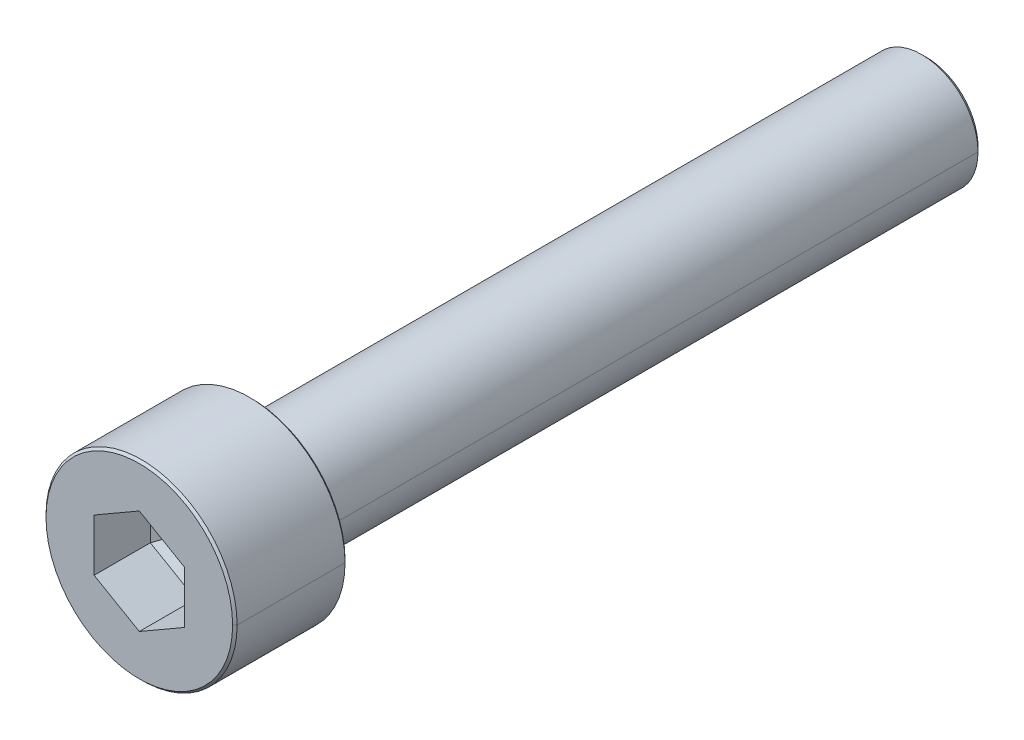
ISO-10303-21;
HEADER;
FILE_DESCRIPTION(('STEP AP214'),'2;1');
FILE_NAME('part.step','',(''),(''),'','','');
FILE_SCHEMA(('AUTOMOTIVE_DESIGN { 1 0 10303 214 1 1 1 1 }'));
ENDSEC;
DATA;
#1=APPLICATION_CONTEXT('core data for automotive mechanical design processes');
#2=APPLICATION_PROTOCOL_DEFINITION('international standard','automotive_design',2000,#1);
#3=PRODUCT_CONTEXT('',#1,'mechanical');
#4=PRODUCT('Part','Part','',(#3));
#5=PRODUCT_RELATED_PRODUCT_CATEGORY('part','',(#4));
#6=PRODUCT_DEFINITION_FORMATION('','',#4);
#7=PRODUCT_DEFINITION_CONTEXT('part definition',#1,'design');
#8=PRODUCT_DEFINITION('design','',#6,#7);
#9=PRODUCT_DEFINITION_SHAPE('','',#8);
#10=(LENGTH_UNIT() NAMED_UNIT(*) SI_UNIT(.MILLI.,.METRE.));
#11=(NAMED_UNIT(*) PLANE_ANGLE_UNIT() SI_UNIT($,.RADIAN.));
#12=(NAMED_UNIT(*) SI_UNIT($,.STERADIAN.) SOLID_ANGLE_UNIT());
#13=UNCERTAINTY_MEASURE_WITH_UNIT(LENGTH_MEASURE(1.E-05),#10,'distance_accuracy_value','');
#14=(GEOMETRIC_REPRESENTATION_CONTEXT(3) GLOBAL_UNCERTAINTY_ASSIGNED_CONTEXT((#13)) GLOBAL_UNIT_ASSIGNED_CONTEXT((#10,
#11,#12)) REPRESENTATION_CONTEXT('',''));
#15=CARTESIAN_POINT('',(0.,0.,0.));
#16=DIRECTION('',(0.,0.,1.));
#17=DIRECTION('',(1.,0.,0.));
#18=AXIS2_PLACEMENT_3D('',#15,#16,#17);
#19=CARTESIAN_POINT('',(0.,0.,30.));
#20=DIRECTION('',(0.,0.,1.));
#21=DIRECTION('',(1.,0.,0.));
#22=AXIS2_PLACEMENT_3D('',#19,#20,#21);
#23=CYLINDRICAL_SURFACE('',#22,4.25);
#24=DIRECTION('',(0.,0.,1.));
#25=VECTOR('',#24,1.);
#26=CARTESIAN_POINT('',(4.249996284604,1.7326560756E-09,30.10000371464));
#27=LINE('',#26,#25);
#28=CARTESIAN_POINT('',(4.25,0.,30.10000300806));
#29=VERTEX_POINT('',#28);
#30=CARTESIAN_POINT('',(4.25,0.,34.89999699194));
#31=VERTEX_POINT('',#30);
#32=EDGE_CURVE('E260',#29,#31,#27,.T.);
#33=ORIENTED_EDGE('',*,*,#32,.F.);
#34=CARTESIAN_POINT('',(0.,0.,30.10000300806));
#35=DIRECTION('',(0.,0.,-1.));
#36=DIRECTION('',(-1.,0.,0.));
#37=AXIS2_PLACEMENT_3D('',#34,#35,#36);
#38=CIRCLE('',#37,4.25);
#39=CARTESIAN_POINT('',(-4.25,0.,30.10000300806));
#40=VERTEX_POINT('',#39);
#41=EDGE_CURVE('E264',#40,#29,#38,.T.);
#42=ORIENTED_EDGE('',*,*,#41,.F.);
#43=DIRECTION('',(0.,0.,1.));
#44=VECTOR('',#43,1.);
#45=CARTESIAN_POINT('',(-4.249996284604,-1.732655414687E-09,30.10000371464));
#46=LINE('',#45,#44);
#47=CARTESIAN_POINT('',(-4.25,0.,34.89999699194));
#48=VERTEX_POINT('',#47);
#49=EDGE_CURVE('E271',#40,#48,#46,.T.);
#50=ORIENTED_EDGE('',*,*,#49,.T.);
#51=CARTESIAN_POINT('',(0.,0.,34.89999699194));
#52=DIRECTION('',(0.,0.,1.));
#53=DIRECTION('',(1.,0.,0.));
#54=AXIS2_PLACEMENT_3D('',#51,#52,#53);
#55=CIRCLE('',#54,4.25);
#56=EDGE_CURVE('E10',#31,#48,#55,.T.);
#57=ORIENTED_EDGE('',*,*,#56,.F.);
#58=EDGE_LOOP('',(#33,#42,#50,#57));
#59=FACE_BOUND('',#58,.T.);
#60=ADVANCED_FACE('F15',(#59),#23,.T.);
#61=CARTESIAN_POINT('',(-1.805222638041E-13,0.,34.94999239115));
#62=DIRECTION('',(0.,0.,-1.));
#63=DIRECTION('',(0.,-1.,0.));
#64=AXIS2_PLACEMENT_3D('',#61,#62,#63);
#65=CONICAL_SURFACE('',#64,4.199992923601,0.785396415152999);
#66=DIRECTION('',(0.707114713395856,-3.69955042404077E-09,-0.707098848888256));
#67=VECTOR('',#66,1.);
#68=CARTESIAN_POINT('',(4.1499951627,2.25585126486E-09,34.99999516368));
#69=LINE('',#68,#67);
#70=CARTESIAN_POINT('',(4.149991295651,0.,34.99999419393));
#71=VERTEX_POINT('',#70);
#72=EDGE_CURVE('E475',#71,#31,#69,.T.);
#73=ORIENTED_EDGE('',*,*,#72,.T.);
#74=ORIENTED_EDGE('',*,*,#56,.T.);
#75=DIRECTION('',(-0.707114713395756,3.69952877155077E-09,-0.707098848888356));
#76=VECTOR('',#75,1.);
#77=CARTESIAN_POINT('',(-4.1499951627,-2.255849692886E-09,34.99999516368));
#78=LINE('',#77,#76);
#79=CARTESIAN_POINT('',(-4.149991295651,0.,34.99999419393));
#80=VERTEX_POINT('',#79);
#81=EDGE_CURVE('E351',#80,#48,#78,.T.);
#82=ORIENTED_EDGE('',*,*,#81,.F.);
#83=CARTESIAN_POINT('',(-1.805222638041E-13,0.,34.99999419393));
#84=DIRECTION('',(0.,0.,1.));
#85=DIRECTION('',(1.,0.,0.));
#86=AXIS2_PLACEMENT_3D('',#83,#84,#85);
#87=CIRCLE('',#86,4.149991295651);
#88=EDGE_CURVE('E324',#71,#80,#87,.T.);
#89=ORIENTED_EDGE('',*,*,#88,.F.);
#90=EDGE_LOOP('',(#73,#74,#82,#89));
#91=FACE_BOUND('',#90,.T.);
#92=ADVANCED_FACE('F17',(#91),#65,.T.);
#93=CARTESIAN_POINT('',(0.,0.,31.25));
#94=DIRECTION('',(0.,0.,1.));
#95=DIRECTION('',(1.,0.,0.));
#96=AXIS2_PLACEMENT_3D('',#93,#94,#95);
#97=PLANE('',#96);
#98=DIRECTION('',(-0.866025403784429,0.500000000000017,0.));
#99=VECTOR('',#98,1.);
#100=CARTESIAN_POINT('',(0.08660254037844,0.05,31.25));
#101=LINE('',#100,#99);
#102=CARTESIAN_POINT('',(0.08660254037844,0.05,31.25));
#103=VERTEX_POINT('',#102);
#104=CARTESIAN_POINT('',(0.,0.1,31.25));
#105=VERTEX_POINT('',#104);
#106=EDGE_CURVE('E459',#103,#105,#101,.T.);
#107=ORIENTED_EDGE('',*,*,#106,.T.);
#108=DIRECTION('',(-0.866025403784429,-0.500000000000017,0.));
#109=VECTOR('',#108,1.);
#110=CARTESIAN_POINT('',(0.,0.1,31.25));
#111=LINE('',#110,#109);
#112=CARTESIAN_POINT('',(-0.08660254037844,0.05,31.25));
#113=VERTEX_POINT('',#112);
#114=EDGE_CURVE('E495',#105,#113,#111,.T.);
#115=ORIENTED_EDGE('',*,*,#114,.T.);
#116=DIRECTION('',(0.,-1.,0.));
#117=VECTOR('',#116,1.);
#118=CARTESIAN_POINT('',(-0.08660254037844,0.05,31.25));
#119=LINE('',#118,#117);
#120=CARTESIAN_POINT('',(-0.08660254037844,-0.05,31.25));
#121=VERTEX_POINT('',#120);
#122=EDGE_CURVE('E42',#113,#121,#119,.T.);
#123=ORIENTED_EDGE('',*,*,#122,.T.);
#124=DIRECTION('',(0.866025403784429,-0.500000000000017,0.));
#125=VECTOR('',#124,1.);
#126=CARTESIAN_POINT('',(-0.08660254037844,-0.05,31.25));
#127=LINE('',#126,#125);
#128=CARTESIAN_POINT('',(0.,-0.1,31.25));
#129=VERTEX_POINT('',#128);
#130=EDGE_CURVE('E336',#121,#129,#127,.T.);
#131=ORIENTED_EDGE('',*,*,#130,.T.);
#132=DIRECTION('',(0.866025403784429,0.500000000000017,0.));
#133=VECTOR('',#132,1.);
#134=CARTESIAN_POINT('',(0.,-0.1,31.25));
#135=LINE('',#134,#133);
#136=CARTESIAN_POINT('',(0.08660254037844,-0.05,31.25));
#137=VERTEX_POINT('',#136);
#138=EDGE_CURVE('E310',#129,#137,#135,.T.);
#139=ORIENTED_EDGE('',*,*,#138,.T.);
#140=DIRECTION('',(0.,1.,0.));
#141=VECTOR('',#140,1.);
#142=CARTESIAN_POINT('',(0.08660254037844,-0.05,31.25));
#143=LINE('',#142,#141);
#144=EDGE_CURVE('E303',#137,#103,#143,.T.);
#145=ORIENTED_EDGE('',*,*,#144,.T.);
#146=EDGE_LOOP('',(#107,#115,#123,#131,#139,#145));
#147=FACE_BOUND('',#146,.T.);
#148=ADVANCED_FACE('F256',(#147),#97,.T.);
#149=CARTESIAN_POINT('',(-2.01,1.160474041071,35.));
#150=DIRECTION('',(-1.,0.,0.));
#151=DIRECTION('',(0.,0.,1.));
#152=AXIS2_PLACEMENT_3D('',#149,#150,#151);
#153=PLANE('',#152);
#154=DIRECTION('',(0.,0.,-1.));
#155=VECTOR('',#154,1.);
#156=CARTESIAN_POINT('',(-2.01,1.160474041071,35.));
#157=LINE('',#156,#155);
#158=CARTESIAN_POINT('',(-2.01,1.160474041071,35.));
#159=VERTEX_POINT('',#158);
#160=CARTESIAN_POINT('',(-2.01,1.160474041071,32.5));
#161=VERTEX_POINT('',#160);
#162=EDGE_CURVE('E343',#159,#161,#157,.T.);
#163=ORIENTED_EDGE('',*,*,#162,.F.);
#164=DIRECTION('',(0.,-1.,0.));
#165=VECTOR('',#164,1.);
#166=CARTESIAN_POINT('',(-2.01,1.160474041071,35.));
#167=LINE('',#166,#165);
#168=CARTESIAN_POINT('',(-2.01,-1.160474041071,35.));
#169=VERTEX_POINT('',#168);
#170=EDGE_CURVE('E315',#159,#169,#167,.T.);
#171=ORIENTED_EDGE('',*,*,#170,.T.);
#172=DIRECTION('',(0.,0.,-1.));
#173=VECTOR('',#172,1.);
#174=CARTESIAN_POINT('',(-2.01,-1.160474041071,35.));
#175=LINE('',#174,#173);
#176=CARTESIAN_POINT('',(-2.01,-1.160474041071,32.5));
#177=VERTEX_POINT('',#176);
#178=EDGE_CURVE('E337',#169,#177,#175,.T.);
#179=ORIENTED_EDGE('',*,*,#178,.T.);
#180=DIRECTION('',(0.,-1.,0.));
#181=VECTOR('',#180,1.);
#182=CARTESIAN_POINT('',(-2.01,1.160474041071,32.5));
#183=LINE('',#182,#181);
#184=EDGE_CURVE('E28',#161,#177,#183,.T.);
#185=ORIENTED_EDGE('',*,*,#184,.F.);
#186=EDGE_LOOP('',(#163,#171,#179,#185));
#187=FACE_BOUND('',#186,.T.);
#188=ADVANCED_FACE('F247',(#187),#153,.F.);
#189=CARTESIAN_POINT('',(-1.048301270189,0.,31.875));
#190=DIRECTION('',(-0.544924498419526,0.,-0.83848511675654));
#191=DIRECTION('',(-0.83848511675654,0.,0.544924498419526));
#192=AXIS2_PLACEMENT_3D('',#189,#190,#191);
#193=PLANE('',#192);
#194=DIRECTION('',(-0.754702467602987,-0.435727672828592,0.490474852082491));
#195=VECTOR('',#194,1.);
#196=CARTESIAN_POINT('',(-0.08660254037844,-0.05,31.25));
#197=LINE('',#196,#195);
#198=EDGE_CURVE('E318',#121,#177,#197,.T.);
#199=ORIENTED_EDGE('',*,*,#198,.F.);
#200=ORIENTED_EDGE('',*,*,#122,.F.);
#201=DIRECTION('',(-0.754702467602987,0.435727672828592,0.490474852082491));
#202=VECTOR('',#201,1.);
#203=CARTESIAN_POINT('',(-0.08660254037844,0.05,31.25));
#204=LINE('',#203,#202);
#205=EDGE_CURVE('E504',#113,#161,#204,.T.);
#206=ORIENTED_EDGE('',*,*,#205,.T.);
#207=ORIENTED_EDGE('',*,*,#184,.T.);
#208=EDGE_LOOP('',(#199,#200,#206,#207));
#209=FACE_BOUND('',#208,.T.);
#210=ADVANCED_FACE('F238',(#209),#193,.F.);
#211=CARTESIAN_POINT('',(-0.5241506350946,-0.9078555308034,31.875));
#212=DIRECTION('',(-0.272462249209806,-0.471918458775812,-0.838485116756521));
#213=DIRECTION('',(0.,-0.871455345657283,0.490474852082494));
#214=AXIS2_PLACEMENT_3D('',#211,#212,#213);
#215=PLANE('',#214);
#216=DIRECTION('',(0.,-0.871455345657285,0.490474852082492));
#217=VECTOR('',#216,1.);
#218=CARTESIAN_POINT('',(0.,-0.1,31.25));
#219=LINE('',#218,#217);
#220=CARTESIAN_POINT('',(0.,-2.320948082142,32.5));
#221=VERTEX_POINT('',#220);
#222=EDGE_CURVE('E463',#129,#221,#219,.T.);
#223=ORIENTED_EDGE('',*,*,#222,.F.);
#224=ORIENTED_EDGE('',*,*,#130,.F.);
#225=ORIENTED_EDGE('',*,*,#198,.T.);
#226=DIRECTION('',(0.866025403784429,-0.500000000000017,0.));
#227=VECTOR('',#226,1.);
#228=CARTESIAN_POINT('',(-2.01,-1.160474041071,32.5));
#229=LINE('',#228,#227);
#230=EDGE_CURVE('E341',#177,#221,#229,.T.);
#231=ORIENTED_EDGE('',*,*,#230,.T.);
#232=EDGE_LOOP('',(#223,#224,#225,#231));
#233=FACE_BOUND('',#232,.T.);
#234=ADVANCED_FACE('F236',(#233),#215,.F.);
#235=CARTESIAN_POINT('',(-2.01,-1.160474041071,35.));
#236=DIRECTION('',(-0.500000000000017,-0.866025403784429,0.));
#237=DIRECTION('',(-0.866025403784429,0.500000000000017,0.));
#238=AXIS2_PLACEMENT_3D('',#235,#236,#237);
#239=PLANE('',#238);
#240=ORIENTED_EDGE('',*,*,#178,.F.);
#241=DIRECTION('',(0.866025403784429,-0.500000000000017,0.));
#242=VECTOR('',#241,1.);
#243=CARTESIAN_POINT('',(-2.01,-1.160474041071,35.));
#244=LINE('',#243,#242);
#245=CARTESIAN_POINT('',(0.,-2.320948082142,35.));
#246=VERTEX_POINT('',#245);
#247=EDGE_CURVE('E332',#169,#246,#244,.T.);
#248=ORIENTED_EDGE('',*,*,#247,.T.);
#249=DIRECTION('',(0.,0.,-1.));
#250=VECTOR('',#249,1.);
#251=CARTESIAN_POINT('',(0.,-2.320948082142,35.));
#252=LINE('',#251,#250);
#253=EDGE_CURVE('E342',#246,#221,#252,.T.);
#254=ORIENTED_EDGE('',*,*,#253,.T.);
#255=ORIENTED_EDGE('',*,*,#230,.F.);
#256=EDGE_LOOP('',(#240,#248,#254,#255));
#257=FACE_BOUND('',#256,.T.);
#258=ADVANCED_FACE('F206',(#257),#239,.F.);
#259=CARTESIAN_POINT('',(0.,-2.320948082142,35.));
#260=DIRECTION('',(0.500000000000017,-0.866025403784429,0.));
#261=DIRECTION('',(0.,0.,-1.));
#262=AXIS2_PLACEMENT_3D('',#259,#260,#261);
#263=PLANE('',#262);
#264=ORIENTED_EDGE('',*,*,#253,.F.);
#265=DIRECTION('',(0.866025403784429,0.500000000000017,0.));
#266=VECTOR('',#265,1.);
#267=CARTESIAN_POINT('',(0.,-2.320948082142,35.));
#268=LINE('',#267,#266);
#269=CARTESIAN_POINT('',(2.01,-1.160474041071,35.));
#270=VERTEX_POINT('',#269);
#271=EDGE_CURVE('E480',#246,#270,#268,.T.);
#272=ORIENTED_EDGE('',*,*,#271,.T.);
#273=DIRECTION('',(0.,0.,-1.));
#274=VECTOR('',#273,1.);
#275=CARTESIAN_POINT('',(2.01,-1.160474041071,35.));
#276=LINE('',#275,#274);
#277=CARTESIAN_POINT('',(2.01,-1.160474041071,32.5));
#278=VERTEX_POINT('',#277);
#279=EDGE_CURVE('E352',#270,#278,#276,.T.);
#280=ORIENTED_EDGE('',*,*,#279,.T.);
#281=DIRECTION('',(0.866025403784429,0.500000000000017,0.));
#282=VECTOR('',#281,1.);
#283=CARTESIAN_POINT('',(0.,-2.320948082142,32.5));
#284=LINE('',#283,#282);
#285=EDGE_CURVE('E453',#221,#278,#284,.T.);
#286=ORIENTED_EDGE('',*,*,#285,.F.);
#287=EDGE_LOOP('',(#264,#272,#280,#286));
#288=FACE_BOUND('',#287,.T.);
#289=ADVANCED_FACE('F245',(#288),#263,.F.);
#290=CARTESIAN_POINT('',(0.5241506350946,-0.9078555308034,31.875));
#291=DIRECTION('',(0.272462249209806,-0.471918458775812,-0.838485116756521));
#292=DIRECTION('',(0.,-0.871455345657283,0.490474852082494));
#293=AXIS2_PLACEMENT_3D('',#290,#291,#292);
#294=PLANE('',#293);
#295=DIRECTION('',(0.754702467602987,-0.435727672828592,0.490474852082491));
#296=VECTOR('',#295,1.);
#297=CARTESIAN_POINT('',(0.08660254037844,-0.05,31.25));
#298=LINE('',#297,#296);
#299=EDGE_CURVE('E305',#137,#278,#298,.T.);
#300=ORIENTED_EDGE('',*,*,#299,.F.);
#301=ORIENTED_EDGE('',*,*,#138,.F.);
#302=ORIENTED_EDGE('',*,*,#222,.T.);
#303=ORIENTED_EDGE('',*,*,#285,.T.);
#304=EDGE_LOOP('',(#300,#301,#302,#303));
#305=FACE_BOUND('',#304,.T.);
#306=ADVANCED_FACE('F437',(#305),#294,.F.);
#307=CARTESIAN_POINT('',(1.048301270189,0.,31.875));
#308=DIRECTION('',(0.544924498419526,0.,-0.83848511675654));
#309=DIRECTION('',(0.,-1.,0.));
#310=AXIS2_PLACEMENT_3D('',#307,#308,#309);
#311=PLANE('',#310);
#312=DIRECTION('',(0.754702467602987,0.435727672828592,0.490474852082491));
#313=VECTOR('',#312,1.);
#314=CARTESIAN_POINT('',(0.08660254037844,0.05,31.25));
#315=LINE('',#314,#313);
#316=CARTESIAN_POINT('',(2.01,1.160474041071,32.5));
#317=VERTEX_POINT('',#316);
#318=EDGE_CURVE('E322',#103,#317,#315,.T.);
#319=ORIENTED_EDGE('',*,*,#318,.F.);
#320=ORIENTED_EDGE('',*,*,#144,.F.);
#321=ORIENTED_EDGE('',*,*,#299,.T.);
#322=DIRECTION('',(0.,1.,0.));
#323=VECTOR('',#322,1.);
#324=CARTESIAN_POINT('',(2.01,-1.160474041071,32.5));
#325=LINE('',#324,#323);
#326=EDGE_CURVE('E306',#278,#317,#325,.T.);
#327=ORIENTED_EDGE('',*,*,#326,.T.);
#328=EDGE_LOOP('',(#319,#320,#321,#327));
#329=FACE_BOUND('',#328,.T.);
#330=ADVANCED_FACE('F380',(#329),#311,.F.);
#331=CARTESIAN_POINT('',(2.01,-1.160474041071,35.));
#332=DIRECTION('',(1.,0.,0.));
#333=DIRECTION('',(0.,1.,0.));
#334=AXIS2_PLACEMENT_3D('',#331,#332,#333);
#335=PLANE('',#334);
#336=ORIENTED_EDGE('',*,*,#279,.F.);
#337=DIRECTION('',(0.,1.,0.));
#338=VECTOR('',#337,1.);
#339=CARTESIAN_POINT('',(2.01,-1.160474041071,35.));
#340=LINE('',#339,#338);
#341=CARTESIAN_POINT('',(2.01,1.160474041071,35.));
#342=VERTEX_POINT('',#341);
#343=EDGE_CURVE('E484',#270,#342,#340,.T.);
#344=ORIENTED_EDGE('',*,*,#343,.T.);
#345=DIRECTION('',(0.,0.,-1.));
#346=VECTOR('',#345,1.);
#347=CARTESIAN_POINT('',(2.01,1.160474041071,35.));
#348=LINE('',#347,#346);
#349=EDGE_CURVE('E321',#342,#317,#348,.T.);
#350=ORIENTED_EDGE('',*,*,#349,.T.);
#351=ORIENTED_EDGE('',*,*,#326,.F.);
#352=EDGE_LOOP('',(#336,#344,#350,#351));
#353=FACE_BOUND('',#352,.T.);
#354=ADVANCED_FACE('F375',(#353),#335,.F.);
#355=CARTESIAN_POINT('',(2.01,1.160474041071,35.));
#356=DIRECTION('',(0.500000000000017,0.866025403784429,0.));
#357=DIRECTION('',(0.,0.,-1.));
#358=AXIS2_PLACEMENT_3D('',#355,#356,#357);
#359=PLANE('',#358);
#360=ORIENTED_EDGE('',*,*,#349,.F.);
#361=DIRECTION('',(-0.866025403784429,0.500000000000017,0.));
#362=VECTOR('',#361,1.);
#363=CARTESIAN_POINT('',(2.01,1.160474041071,35.));
#364=LINE('',#363,#362);
#365=CARTESIAN_POINT('',(0.,2.320948082142,35.));
#366=VERTEX_POINT('',#365);
#367=EDGE_CURVE('E327',#342,#366,#364,.T.);
#368=ORIENTED_EDGE('',*,*,#367,.T.);
#369=DIRECTION('',(0.,0.,-1.));
#370=VECTOR('',#369,1.);
#371=CARTESIAN_POINT('',(0.,2.320948082142,35.));
#372=LINE('',#371,#370);
#373=CARTESIAN_POINT('',(0.,2.320948082142,32.5));
#374=VERTEX_POINT('',#373);
#375=EDGE_CURVE('E301',#366,#374,#372,.T.);
#376=ORIENTED_EDGE('',*,*,#375,.T.);
#377=DIRECTION('',(-0.866025403784429,0.500000000000017,0.));
#378=VECTOR('',#377,1.);
#379=CARTESIAN_POINT('',(2.01,1.160474041071,32.5));
#380=LINE('',#379,#378);
#381=EDGE_CURVE('E319',#317,#374,#380,.T.);
#382=ORIENTED_EDGE('',*,*,#381,.F.);
#383=EDGE_LOOP('',(#360,#368,#376,#382));
#384=FACE_BOUND('',#383,.T.);
#385=ADVANCED_FACE('F379',(#384),#359,.F.);
#386=CARTESIAN_POINT('',(0.5241506350946,0.9078555308034,31.875));
#387=DIRECTION('',(0.272462249209806,0.471918458775812,-0.838485116756521));
#388=DIRECTION('',(-0.951049209141104,0.,-0.309039482578005));
#389=AXIS2_PLACEMENT_3D('',#386,#387,#388);
#390=PLANE('',#389);
#391=DIRECTION('',(0.,0.871455345657285,0.490474852082492));
#392=VECTOR('',#391,1.);
#393=CARTESIAN_POINT('',(0.,0.1,31.25));
#394=LINE('',#393,#392);
#395=EDGE_CURVE('E491',#105,#374,#394,.T.);
#396=ORIENTED_EDGE('',*,*,#395,.F.);
#397=ORIENTED_EDGE('',*,*,#106,.F.);
#398=ORIENTED_EDGE('',*,*,#318,.T.);
#399=ORIENTED_EDGE('',*,*,#381,.T.);
#400=EDGE_LOOP('',(#396,#397,#398,#399));
#401=FACE_BOUND('',#400,.T.);
#402=ADVANCED_FACE('F386',(#401),#390,.F.);
#403=CARTESIAN_POINT('',(-0.5241506350946,0.9078555308034,31.875));
#404=DIRECTION('',(-0.272462249209806,0.471918458775812,-0.838485116756521));
#405=DIRECTION('',(-0.951049209141104,0.,0.309039482578005));
#406=AXIS2_PLACEMENT_3D('',#403,#404,#405);
#407=PLANE('',#406);
#408=ORIENTED_EDGE('',*,*,#205,.F.);
#409=ORIENTED_EDGE('',*,*,#114,.F.);
#410=ORIENTED_EDGE('',*,*,#395,.T.);
#411=DIRECTION('',(-0.866025403784429,-0.500000000000017,0.));
#412=VECTOR('',#411,1.);
#413=CARTESIAN_POINT('',(0.,2.320948082142,32.5));
#414=LINE('',#413,#412);
#415=EDGE_CURVE('E347',#374,#161,#414,.T.);
#416=ORIENTED_EDGE('',*,*,#415,.T.);
#417=EDGE_LOOP('',(#408,#409,#410,#416));
#418=FACE_BOUND('',#417,.T.);
#419=ADVANCED_FACE('F382',(#418),#407,.F.);
#420=CARTESIAN_POINT('',(0.,2.320948082142,35.));
#421=DIRECTION('',(-0.500000000000017,0.866025403784429,0.));
#422=DIRECTION('',(0.,0.,1.));
#423=AXIS2_PLACEMENT_3D('',#420,#421,#422);
#424=PLANE('',#423);
#425=ORIENTED_EDGE('',*,*,#375,.F.);
#426=DIRECTION('',(-0.866025403784429,-0.500000000000017,0.));
#427=VECTOR('',#426,1.);
#428=CARTESIAN_POINT('',(0.,2.320948082142,35.));
#429=LINE('',#428,#427);
#430=EDGE_CURVE('E311',#366,#159,#429,.T.);
#431=ORIENTED_EDGE('',*,*,#430,.T.);
#432=ORIENTED_EDGE('',*,*,#162,.T.);
#433=ORIENTED_EDGE('',*,*,#415,.F.);
#434=EDGE_LOOP('',(#425,#431,#432,#433));
#435=FACE_BOUND('',#434,.T.);
#436=ADVANCED_FACE('F385',(#435),#424,.F.);
#437=CARTESIAN_POINT('',(0.,0.,35.));
#438=DIRECTION('',(0.,0.,1.));
#439=DIRECTION('',(1.,0.,0.));
#440=AXIS2_PLACEMENT_3D('',#437,#438,#439);
#441=PLANE('',#440);
#442=ORIENTED_EDGE('',*,*,#367,.F.);
#443=ORIENTED_EDGE('',*,*,#343,.F.);
#444=ORIENTED_EDGE('',*,*,#271,.F.);
#445=ORIENTED_EDGE('',*,*,#247,.F.);
#446=ORIENTED_EDGE('',*,*,#170,.F.);
#447=ORIENTED_EDGE('',*,*,#430,.F.);
#448=EDGE_LOOP('',(#442,#443,#444,#445,#446,#447));
#449=FACE_BOUND('',#448,.T.);
#450=CARTESIAN_POINT('',(0.,0.,34.99999419393));
#451=DIRECTION('',(0.,0.,1.));
#452=DIRECTION('',(-1.,0.,0.));
#453=AXIS2_PLACEMENT_3D('',#450,#451,#452);
#454=CIRCLE('',#453,4.149991295651);
#455=EDGE_CURVE('E328',#80,#71,#454,.T.);
#456=ORIENTED_EDGE('',*,*,#455,.T.);
#457=ORIENTED_EDGE('',*,*,#88,.T.);
#458=EDGE_LOOP('',(#456,#457));
#459=FACE_BOUND('',#458,.T.);
#460=ADVANCED_FACE('F393',(#449,#459),#441,.T.);
#461=CARTESIAN_POINT('',(0.,0.,34.94999239115));
#462=DIRECTION('',(0.,0.,-1.));
#463=DIRECTION('',(0.,-1.,0.));
#464=AXIS2_PLACEMENT_3D('',#461,#462,#463);
#465=CONICAL_SURFACE('',#464,4.199992923601,0.785396415152999);
#466=ORIENTED_EDGE('',*,*,#81,.T.);
#467=CARTESIAN_POINT('',(0.,0.,34.89999699194));
#468=DIRECTION('',(0.,0.,1.));
#469=DIRECTION('',(-1.,0.,0.));
#470=AXIS2_PLACEMENT_3D('',#467,#468,#469);
#471=CIRCLE('',#470,4.25);
#472=EDGE_CURVE('E270',#48,#31,#471,.T.);
#473=ORIENTED_EDGE('',*,*,#472,.T.);
#474=ORIENTED_EDGE('',*,*,#72,.F.);
#475=ORIENTED_EDGE('',*,*,#455,.F.);
#476=EDGE_LOOP('',(#466,#473,#474,#475));
#477=FACE_BOUND('',#476,.T.);
#478=ADVANCED_FACE('F390',(#477),#465,.T.);
#479=CARTESIAN_POINT('',(0.,0.,30.));
#480=DIRECTION('',(0.,0.,1.));
#481=DIRECTION('',(1.,0.,0.));
#482=AXIS2_PLACEMENT_3D('',#479,#480,#481);
#483=CYLINDRICAL_SURFACE('',#482,4.25);
#484=ORIENTED_EDGE('',*,*,#49,.F.);
#485=CARTESIAN_POINT('',(0.,0.,30.10000300806));
#486=DIRECTION('',(0.,0.,-1.));
#487=DIRECTION('',(1.,0.,0.));
#488=AXIS2_PLACEMENT_3D('',#485,#486,#487);
#489=CIRCLE('',#488,4.25);
#490=EDGE_CURVE('E274',#29,#40,#489,.T.);
#491=ORIENTED_EDGE('',*,*,#490,.F.);
#492=ORIENTED_EDGE('',*,*,#32,.T.);
#493=ORIENTED_EDGE('',*,*,#472,.F.);
#494=EDGE_LOOP('',(#484,#491,#492,#493));
#495=FACE_BOUND('',#494,.T.);
#496=ADVANCED_FACE('F276',(#495),#483,.T.);
#497=CARTESIAN_POINT('',(0.,0.,30.05000760885));
#498=DIRECTION('',(0.,0.,1.));
#499=DIRECTION('',(0.,-1.,0.));
#500=AXIS2_PLACEMENT_3D('',#497,#498,#499);
#501=CONICAL_SURFACE('',#500,4.199992923601,0.785396415152999);
#502=DIRECTION('',(0.707114713395706,-3.69955164087403E-09,0.707098848888406));
#503=VECTOR('',#502,1.);
#504=CARTESIAN_POINT('',(4.1499951627,2.255851686751E-09,30.00000483632));
#505=LINE('',#504,#503);
#506=CARTESIAN_POINT('',(4.149991295651,0.,30.00000580607));
#507=VERTEX_POINT('',#506);
#508=EDGE_CURVE('E279',#507,#29,#505,.T.);
#509=ORIENTED_EDGE('',*,*,#508,.T.);
#510=ORIENTED_EDGE('',*,*,#490,.T.);
#511=DIRECTION('',(-0.707114713395706,3.69954574813403E-09,0.707098848888406));
#512=VECTOR('',#511,1.);
#513=CARTESIAN_POINT('',(-4.1499951627,-2.255850192479E-09,30.00000483632));
#514=LINE('',#513,#512);
#515=CARTESIAN_POINT('',(-4.149991295651,0.,30.00000580607));
#516=VERTEX_POINT('',#515);
#517=EDGE_CURVE('E290',#516,#40,#514,.T.);
#518=ORIENTED_EDGE('',*,*,#517,.F.);
#519=CARTESIAN_POINT('',(0.,0.,30.00000580607));
#520=DIRECTION('',(0.,0.,-1.));
#521=DIRECTION('',(1.,0.,0.));
#522=AXIS2_PLACEMENT_3D('',#519,#520,#521);
#523=CIRCLE('',#522,4.149991295651);
#524=EDGE_CURVE('E283',#507,#516,#523,.T.);
#525=ORIENTED_EDGE('',*,*,#524,.F.);
#526=EDGE_LOOP('',(#509,#510,#518,#525));
#527=FACE_BOUND('',#526,.T.);
#528=ADVANCED_FACE('F208',(#527),#501,.T.);
#529=CARTESIAN_POINT('',(0.,0.,30.05000760885));
#530=DIRECTION('',(0.,0.,1.));
#531=DIRECTION('',(0.,-1.,0.));
#532=AXIS2_PLACEMENT_3D('',#529,#530,#531);
#533=CONICAL_SURFACE('',#532,4.199992923601,0.785396415152999);
#534=ORIENTED_EDGE('',*,*,#517,.T.);
#535=ORIENTED_EDGE('',*,*,#41,.T.);
#536=ORIENTED_EDGE('',*,*,#508,.F.);
#537=CARTESIAN_POINT('',(0.,0.,30.00000580607));
#538=DIRECTION('',(0.,0.,-1.));
#539=DIRECTION('',(-1.,0.,0.));
#540=AXIS2_PLACEMENT_3D('',#537,#538,#539);
#541=CIRCLE('',#540,4.149991295651);
#542=EDGE_CURVE('E297',#516,#507,#541,.T.);
#543=ORIENTED_EDGE('',*,*,#542,.F.);
#544=EDGE_LOOP('',(#534,#535,#536,#543));
#545=FACE_BOUND('',#544,.T.);
#546=ADVANCED_FACE('F289',(#545),#533,.T.);
#547=CARTESIAN_POINT('',(0.,0.,30.));
#548=DIRECTION('',(0.,0.,1.));
#549=DIRECTION('',(1.,0.,0.));
#550=AXIS2_PLACEMENT_3D('',#547,#548,#549);
#551=PLANE('',#550);
#552=CARTESIAN_POINT('',(0.,0.,30.));
#553=DIRECTION('',(0.,0.,1.));
#554=DIRECTION('',(-1.,0.,0.));
#555=AXIS2_PLACEMENT_3D('',#552,#553,#554);
#556=CIRCLE('',#555,2.5);
#557=CARTESIAN_POINT('',(-2.5,0.,30.));
#558=VERTEX_POINT('',#557);
#559=CARTESIAN_POINT('',(2.5,0.,30.));
#560=VERTEX_POINT('',#559);
#561=EDGE_CURVE('E412',#558,#560,#556,.T.);
#562=ORIENTED_EDGE('',*,*,#561,.T.);
#563=CARTESIAN_POINT('',(0.,0.,30.));
#564=DIRECTION('',(0.,0.,1.));
#565=DIRECTION('',(1.,0.,0.));
#566=AXIS2_PLACEMENT_3D('',#563,#564,#565);
#567=CIRCLE('',#566,2.5);
#568=EDGE_CURVE('E423',#560,#558,#567,.T.);
#569=ORIENTED_EDGE('',*,*,#568,.T.);
#570=EDGE_LOOP('',(#562,#569));
#571=FACE_BOUND('',#570,.T.);
#572=ORIENTED_EDGE('',*,*,#524,.T.);
#573=ORIENTED_EDGE('',*,*,#542,.T.);
#574=EDGE_LOOP('',(#572,#573));
#575=FACE_BOUND('',#574,.T.);
#576=ADVANCED_FACE('F234',(#571,#575),#551,.F.);
#577=CARTESIAN_POINT('',(0.,0.,0.));
#578=DIRECTION('',(0.,0.,1.));
#579=DIRECTION('',(1.,0.,0.));
#580=AXIS2_PLACEMENT_3D('',#577,#578,#579);
#581=CYLINDRICAL_SURFACE('',#580,2.5);
#582=DIRECTION('',(-2.92874283535187E-07,-3.48045189545685E-11,0.999999999999957));
#583=VECTOR('',#582,1.);
#584=CARTESIAN_POINT('',(-2.499991272349,1.037174667316E-09,0.2000087256491));
#585=LINE('',#584,#583);
#586=CARTESIAN_POINT('',(-2.5,0.,0.2000044243595));
#587=VERTEX_POINT('',#586);
#588=EDGE_CURVE('E419',#587,#558,#585,.T.);
#589=ORIENTED_EDGE('',*,*,#588,.T.);
#590=ORIENTED_EDGE('',*,*,#568,.F.);
#591=DIRECTION('',(2.92874283579887E-07,3.48045159345385E-11,0.999999999999957));
#592=VECTOR('',#591,1.);
#593=CARTESIAN_POINT('',(2.499991272349,-1.037174577319E-09,0.2000087256491));
#594=LINE('',#593,#592);
#595=CARTESIAN_POINT('',(2.5,0.,0.2000044243595));
#596=VERTEX_POINT('',#595);
#597=EDGE_CURVE('E403',#596,#560,#594,.T.);
#598=ORIENTED_EDGE('',*,*,#597,.F.);
#599=CARTESIAN_POINT('',(0.,0.,0.2000044243595));
#600=DIRECTION('',(0.,0.,-1.));
#601=DIRECTION('',(-1.,0.,0.));
#602=AXIS2_PLACEMENT_3D('',#599,#600,#601);
#603=CIRCLE('',#602,2.49996951794084);
#604=EDGE_CURVE('E175',#587,#596,#603,.T.);
#605=ORIENTED_EDGE('',*,*,#604,.F.);
#606=EDGE_LOOP('',(#589,#590,#598,#605));
#607=FACE_BOUND('',#606,.T.);
#608=ADVANCED_FACE('F224',(#607),#581,.T.);
#609=CARTESIAN_POINT('',(0.,0.,0.));
#610=DIRECTION('',(0.,0.,1.));
#611=DIRECTION('',(1.,0.,0.));
#612=AXIS2_PLACEMENT_3D('',#609,#610,#611);
#613=CYLINDRICAL_SURFACE('',#612,2.5);
#614=ORIENTED_EDGE('',*,*,#597,.T.);
#615=ORIENTED_EDGE('',*,*,#561,.F.);
#616=ORIENTED_EDGE('',*,*,#588,.F.);
#617=CARTESIAN_POINT('',(0.,0.,0.2000044243595));
#618=DIRECTION('',(0.,0.,-1.));
#619=DIRECTION('',(1.,0.,0.));
#620=AXIS2_PLACEMENT_3D('',#617,#618,#619);
#621=CIRCLE('',#620,2.49996951794084);
#622=EDGE_CURVE('E169',#596,#587,#621,.T.);
#623=ORIENTED_EDGE('',*,*,#622,.F.);
#624=EDGE_LOOP('',(#614,#615,#616,#623));
#625=FACE_BOUND('',#624,.T.);
#626=ADVANCED_FACE('F233',(#625),#613,.T.);
#627=CARTESIAN_POINT('',(0.,0.,0.1000175848511));
#628=DIRECTION('',(0.,0.,1.));
#629=DIRECTION('',(0.,-1.,0.));
#630=AXIS2_PLACEMENT_3D('',#627,#628,#629);
#631=CONICAL_SURFACE('',#630,2.399984074503,0.785391182077151);
#632=DIRECTION('',(0.707113774581914,8.31179004637117E-10,0.707099787722014));
#633=VECTOR('',#632,1.);
#634=CARTESIAN_POINT('',(2.299989294081,-1.272267501821E-09,1.070346292265E-05));
#635=LINE('',#634,#633);
#636=CARTESIAN_POINT('',(2.299981938323,0.,1.40523677632E-05));
#637=VERTEX_POINT('',#636);
#638=EDGE_CURVE('E181',#637,#596,#635,.T.);
#639=ORIENTED_EDGE('',*,*,#638,.T.);
#640=ORIENTED_EDGE('',*,*,#622,.T.);
#641=DIRECTION('',(-0.707113774581914,-8.31178809079717E-10,0.707099787722014));
#642=VECTOR('',#641,1.);
#643=CARTESIAN_POINT('',(-2.299989294081,1.272267536506E-09,1.070346292161E-05));
#644=LINE('',#643,#642);
#645=CARTESIAN_POINT('',(-2.299981938323,0.,1.40523677632E-05));
#646=VERTEX_POINT('',#645);
#647=EDGE_CURVE('E162',#646,#587,#644,.T.);
#648=ORIENTED_EDGE('',*,*,#647,.F.);
#649=CARTESIAN_POINT('',(2.299981938323,0.,0.));
#650=CARTESIAN_POINT('',(2.299981938323,-0.226250446929455,0.));
#651=CARTESIAN_POINT('',(2.25578843030049,-0.448704216978713,0.));
#652=CARTESIAN_POINT('',(2.21175522488586,-0.670351083003686,0.));
#653=CARTESIAN_POINT('',(2.12490623796225,-0.880164982535158,0.));
#654=CARTESIAN_POINT('',(2.03847795977589,-1.08896251395628,0.));
#655=CARTESIAN_POINT('',(1.91236509056028,-1.27780150141498,0.));
#656=CARTESIAN_POINT('',(1.78686312986339,-1.46572572619466,0.));
#657=CARTESIAN_POINT('',(1.62633282519478,-1.62633282519478,0.));
#658=CARTESIAN_POINT('',(1.46658015195468,-1.7861619207638,0.));
#659=CARTESIAN_POINT('',(1.27780150141499,-1.91236509056028,0.));
#660=CARTESIAN_POINT('',(1.0899373212741,-2.03795691440909,0.));
#661=CARTESIAN_POINT('',(0.880164982535158,-2.12490623796225,0.));
#662=CARTESIAN_POINT('',(0.671408810580835,-2.21143436673316,0.));
#663=CARTESIAN_POINT('',(0.448704216978713,-2.25578843030049,0.));
#664=CARTESIAN_POINT('',(0.227078435826957,-2.29992763653045,0.));
#665=CARTESIAN_POINT('',(0.,-2.299981938323,0.));
#666=CARTESIAN_POINT('',(-0.225978435868457,-2.30003597707001,0.));
#667=CARTESIAN_POINT('',(-0.448704216978713,-2.25578843030049,0.));
#668=CARTESIAN_POINT('',(-0.670351083003791,-2.21175522488586,0.));
#669=CARTESIAN_POINT('',(-0.880164982535158,-2.12490623796225,0.));
#670=CARTESIAN_POINT('',(-1.08896251395657,-2.03847795977572,0.));
#671=CARTESIAN_POINT('',(-1.27780150141498,-1.91236509056028,0.));
#672=CARTESIAN_POINT('',(-1.46572572619474,-1.7868631298633,0.));
#673=CARTESIAN_POINT('',(-1.62633282519478,-1.62633282519478,0.));
#674=CARTESIAN_POINT('',(-1.78616192076376,-1.46658015195472,0.));
#675=CARTESIAN_POINT('',(-1.91236509056028,-1.27780150141498,0.));
#676=CARTESIAN_POINT('',(-2.03795691440904,-1.0899373212742,0.));
#677=CARTESIAN_POINT('',(-2.12490623796225,-0.880164982535158,0.));
#678=CARTESIAN_POINT('',(-2.21143436673315,-0.671408810580878,0.));
#679=CARTESIAN_POINT('',(-2.25578843030049,-0.448704216978713,0.));
#680=CARTESIAN_POINT('',(-2.299981938323,-0.226805783049087,0.));
#681=CARTESIAN_POINT('',(-2.299981938323,0.,0.));
#682=B_SPLINE_CURVE_WITH_KNOTS('',2,(#649,#650,#651,#652,#653,#654,#655,#656,#657,#658,#659,
#660,#661,#662,#663,#664,#665,#666,#667,#668,#669,#670,#671,#672,#673,#674,#675,#676,#677,#678,
#679,#680,#681),.UNSPECIFIED.,.F.,.F.,(3,2,2,2,2,2,2,2,2,2,2,2,2,2,2,2,3),(0.,0.0625,0.125,
0.1875,0.25,0.3125,0.375,0.4375,0.5,0.5625,0.625,0.6875,0.75,0.8125,0.875,0.9375,1.),.UNSPECIFIED.);
#683=EDGE_CURVE('E167',#637,#646,#682,.T.);
#684=ORIENTED_EDGE('',*,*,#683,.F.);
#685=EDGE_LOOP('',(#639,#640,#648,#684));
#686=FACE_BOUND('',#685,.T.);
#687=ADVANCED_FACE('F165',(#686),#631,.T.);
#688=CARTESIAN_POINT('',(0.,0.,0.1000175848511));
#689=DIRECTION('',(0.,0.,1.));
#690=DIRECTION('',(0.,-1.,0.));
#691=AXIS2_PLACEMENT_3D('',#688,#689,#690);
#692=CONICAL_SURFACE('',#691,2.399984074503,0.785391182077151);
#693=ORIENTED_EDGE('',*,*,#647,.T.);
#694=ORIENTED_EDGE('',*,*,#604,.T.);
#695=ORIENTED_EDGE('',*,*,#638,.F.);
#696=CARTESIAN_POINT('',(-2.299981938323,0.,0.));
#697=CARTESIAN_POINT('',(-2.299981938323,0.226250446929455,0.));
#698=CARTESIAN_POINT('',(-2.25578843030049,0.448704216978713,0.));
#699=CARTESIAN_POINT('',(-2.21175522488586,0.670351083003686,0.));
#700=CARTESIAN_POINT('',(-2.12490623796225,0.880164982535158,0.));
#701=CARTESIAN_POINT('',(-2.03847795977589,1.08896251395628,0.));
#702=CARTESIAN_POINT('',(-1.91236509056028,1.27780150141498,0.));
#703=CARTESIAN_POINT('',(-1.78686312986339,1.46572572619466,0.));
#704=CARTESIAN_POINT('',(-1.62633282519478,1.62633282519478,0.));
#705=CARTESIAN_POINT('',(-1.46658015195468,1.7861619207638,0.));
#706=CARTESIAN_POINT('',(-1.27780150141499,1.91236509056028,0.));
#707=CARTESIAN_POINT('',(-1.0899373212741,2.03795691440909,0.));
#708=CARTESIAN_POINT('',(-0.880164982535158,2.12490623796225,0.));
#709=CARTESIAN_POINT('',(-0.671408810580835,2.21143436673316,0.));
#710=CARTESIAN_POINT('',(-0.448704216978713,2.25578843030049,0.));
#711=CARTESIAN_POINT('',(-0.227078435826957,2.29992763653045,0.));
#712=CARTESIAN_POINT('',(0.,2.299981938323,0.));
#713=CARTESIAN_POINT('',(0.225978435868457,2.30003597707001,0.));
#714=CARTESIAN_POINT('',(0.448704216978713,2.25578843030049,0.));
#715=CARTESIAN_POINT('',(0.670351083003791,2.21175522488586,0.));
#716=CARTESIAN_POINT('',(0.880164982535158,2.12490623796225,0.));
#717=CARTESIAN_POINT('',(1.08896251395657,2.03847795977572,0.));
#718=CARTESIAN_POINT('',(1.27780150141498,1.91236509056028,0.));
#719=CARTESIAN_POINT('',(1.46572572619474,1.7868631298633,0.));
#720=CARTESIAN_POINT('',(1.62633282519478,1.62633282519478,0.));
#721=CARTESIAN_POINT('',(1.78616192076376,1.46658015195472,0.));
#722=CARTESIAN_POINT('',(1.91236509056028,1.27780150141498,0.));
#723=CARTESIAN_POINT('',(2.03795691440904,1.0899373212742,0.));
#724=CARTESIAN_POINT('',(2.12490623796225,0.880164982535158,0.));
#725=CARTESIAN_POINT('',(2.21143436673315,0.671408810580878,0.));
#726=CARTESIAN_POINT('',(2.25578843030049,0.448704216978713,0.));
#727=CARTESIAN_POINT('',(2.299981938323,0.226805783049087,0.));
#728=CARTESIAN_POINT('',(2.299981938323,0.,0.));
#729=B_SPLINE_CURVE_WITH_KNOTS('',2,(#696,#697,#698,#699,#700,#701,#702,#703,#704,#705,#706,
#707,#708,#709,#710,#711,#712,#713,#714,#715,#716,#717,#718,#719,#720,#721,#722,#723,#724,#725,
#726,#727,#728),.UNSPECIFIED.,.F.,.F.,(3,2,2,2,2,2,2,2,2,2,2,2,2,2,2,2,3),(0.,0.0625,0.125,
0.1875,0.25,0.3125,0.375,0.4375,0.5,0.5625,0.625,0.6875,0.75,0.8125,0.875,0.9375,1.),.UNSPECIFIED.);
#730=EDGE_CURVE('E176',#646,#637,#729,.T.);
#731=ORIENTED_EDGE('',*,*,#730,.F.);
#732=EDGE_LOOP('',(#693,#694,#695,#731));
#733=FACE_BOUND('',#732,.T.);
#734=ADVANCED_FACE('F180',(#733),#692,.T.);
#735=CARTESIAN_POINT('',(0.,0.,0.));
#736=DIRECTION('',(0.,0.,1.));
#737=DIRECTION('',(1.,0.,0.));
#738=AXIS2_PLACEMENT_3D('',#735,#736,#737);
#739=PLANE('',#738);
#740=ORIENTED_EDGE('',*,*,#683,.T.);
#741=ORIENTED_EDGE('',*,*,#730,.T.);
#742=EDGE_LOOP('',(#740,#741));
#743=FACE_BOUND('',#742,.T.);
#744=ADVANCED_FACE('F188',(#743),#739,.F.);
#745=CLOSED_SHELL('',(#60,#92,#148,#188,#210,#234,#258,#289,#306,#330,#354,#385,#402,#419,#436,
#460,#478,#496,#528,#546,#576,#608,#626,#687,#734,#744));
#746=MANIFOLD_SOLID_BREP('B1',#745);
#747=ADVANCED_BREP_SHAPE_REPRESENTATION('',(#18,#746),#14);
#748=SHAPE_DEFINITION_REPRESENTATION(#9,#747);
ENDSEC;
END-ISO-10303-21;
